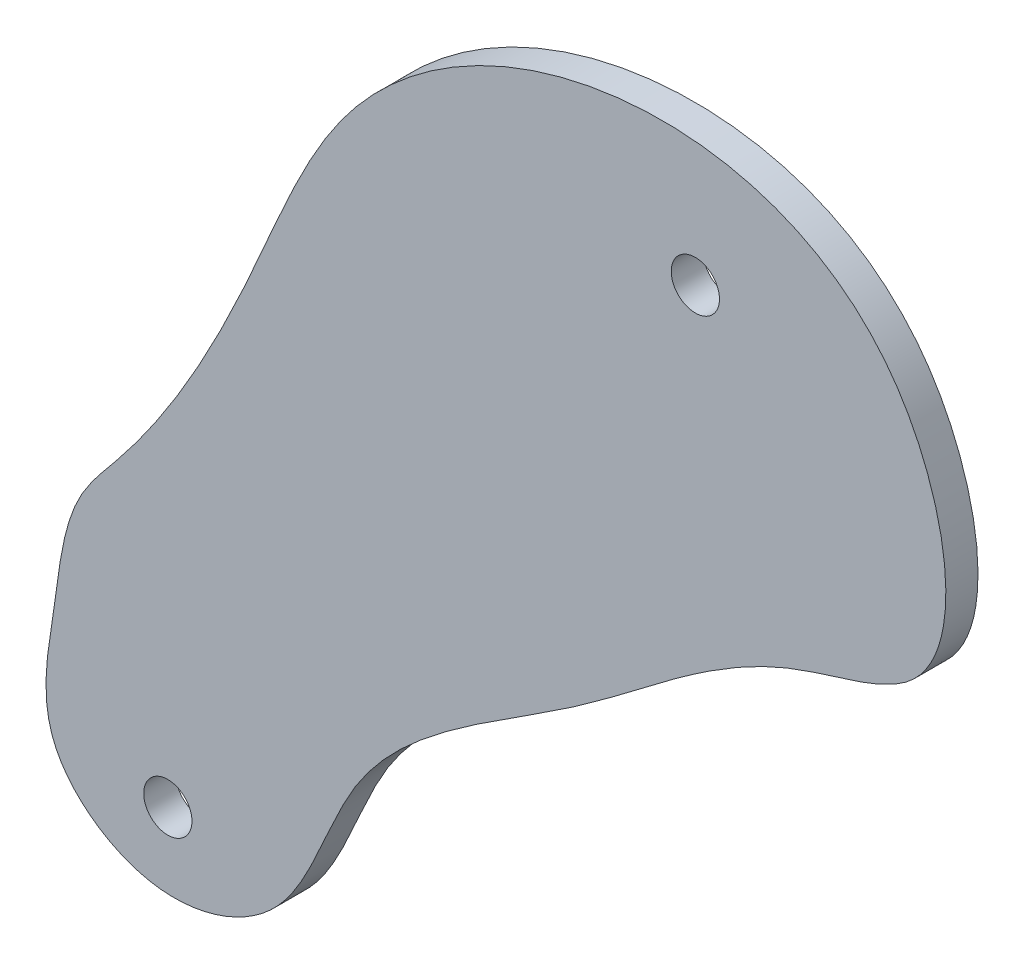
ISO-10303-21;
HEADER;
FILE_DESCRIPTION(('STEP AP214'),'2;1');
FILE_NAME('part.step','',(''),(''),'','','');
FILE_SCHEMA(('AUTOMOTIVE_DESIGN { 1 0 10303 214 1 1 1 1 }'));
ENDSEC;
DATA;
#1=APPLICATION_CONTEXT('core data for automotive mechanical design processes');
#2=APPLICATION_PROTOCOL_DEFINITION('international standard','automotive_design',2000,#1);
#3=PRODUCT_CONTEXT('',#1,'mechanical');
#4=PRODUCT('Part','Part','',(#3));
#5=PRODUCT_RELATED_PRODUCT_CATEGORY('part','',(#4));
#6=PRODUCT_DEFINITION_FORMATION('','',#4);
#7=PRODUCT_DEFINITION_CONTEXT('part definition',#1,'design');
#8=PRODUCT_DEFINITION('design','',#6,#7);
#9=PRODUCT_DEFINITION_SHAPE('','',#8);
#10=(LENGTH_UNIT() NAMED_UNIT(*) SI_UNIT(.MILLI.,.METRE.));
#11=(NAMED_UNIT(*) PLANE_ANGLE_UNIT() SI_UNIT($,.RADIAN.));
#12=(NAMED_UNIT(*) SI_UNIT($,.STERADIAN.) SOLID_ANGLE_UNIT());
#13=UNCERTAINTY_MEASURE_WITH_UNIT(LENGTH_MEASURE(1.E-05),#10,'distance_accuracy_value','');
#14=(GEOMETRIC_REPRESENTATION_CONTEXT(3) GLOBAL_UNCERTAINTY_ASSIGNED_CONTEXT((#13)) GLOBAL_UNIT_ASSIGNED_CONTEXT((#10,
#11,#12)) REPRESENTATION_CONTEXT('',''));
#15=CARTESIAN_POINT('',(0.,0.,0.));
#16=DIRECTION('',(0.,0.,1.));
#17=DIRECTION('',(1.,0.,0.));
#18=AXIS2_PLACEMENT_3D('',#15,#16,#17);
#19=CARTESIAN_POINT('',(279.692520329998,142.4888097413,3.73351036661345));
#20=DIRECTION('',(0.,0.,1.));
#21=DIRECTION('',(1.,0.,0.));
#22=AXIS2_PLACEMENT_3D('',#19,#20,#21);
#23=PLANE('',#22);
#24=CARTESIAN_POINT('',(208.048555384954,96.1469036247698,3.73351036661345));
#25=DIRECTION('',(0.,0.,1.));
#26=DIRECTION('',(1.,0.,0.));
#27=AXIS2_PLACEMENT_3D('',#24,#25,#26);
#28=CIRCLE('',#27,2.38125);
#29=CARTESIAN_POINT('',(210.429805384954,96.1469036247698,3.73351036661345));
#30=VERTEX_POINT('',#29);
#31=EDGE_CURVE('E60',#30,#30,#28,.T.);
#32=ORIENTED_EDGE('',*,*,#31,.F.);
#33=EDGE_LOOP('',(#32));
#34=FACE_BOUND('',#33,.T.);
#35=CARTESIAN_POINT('',(260.138309761165,166.844556812902,3.73351036661345));
#36=DIRECTION('',(0.,0.,1.));
#37=DIRECTION('',(1.,0.,0.));
#38=AXIS2_PLACEMENT_3D('',#35,#36,#37);
#39=CIRCLE('',#38,2.38125);
#40=CARTESIAN_POINT('',(262.519559761165,166.844556812902,3.73351036661345));
#41=VERTEX_POINT('',#40);
#42=EDGE_CURVE('E51',#41,#41,#39,.T.);
#43=ORIENTED_EDGE('',*,*,#42,.F.);
#44=EDGE_LOOP('',(#43));
#45=FACE_BOUND('',#44,.T.);
#46=CARTESIAN_POINT('',(202.929361245628,123.211313888378,3.73351036661345));
#47=CARTESIAN_POINT('',(201.739714405265,121.749830512483,3.73351036661345));
#48=CARTESIAN_POINT('',(197.890302733748,117.390116329477,3.73351036661345));
#49=CARTESIAN_POINT('',(197.036864552965,107.690088163987,3.73351036661345));
#50=CARTESIAN_POINT('',(194.501914276714,95.2537043682636,3.73351036661345));
#51=CARTESIAN_POINT('',(206.384507392569,86.6634191277051,3.73351036661345));
#52=CARTESIAN_POINT('',(218.786123850465,90.8911417489097,3.73351036661345));
#53=CARTESIAN_POINT('',(223.064430740751,99.9923607362149,3.73351036661345));
#54=CARTESIAN_POINT('',(229.145568082793,113.97669399169,3.73351036661345));
#55=CARTESIAN_POINT('',(249.189438648727,123.748329584924,3.73351036661345));
#56=CARTESIAN_POINT('',(264.843217760194,138.802913713592,3.73351036661345));
#57=CARTESIAN_POINT('',(288.149427972228,143.05898755066,3.73351036661345));
#58=CARTESIAN_POINT('',(282.305203308027,177.381342809915,3.73351036661345));
#59=CARTESIAN_POINT('',(248.582859196143,182.538043843834,3.73351036661345));
#60=CARTESIAN_POINT('',(224.914413667774,167.097053658812,3.73351036661345));
#61=CARTESIAN_POINT('',(215.899807197198,144.043459163717,3.73351036661345));
#62=CARTESIAN_POINT('',(208.713846979568,130.317565467772,3.73351036661345));
#63=CARTESIAN_POINT('',(202.929361245628,123.211313888378,3.73351036661345));
#64=B_SPLINE_CURVE_WITH_KNOTS('',3,(#46,#47,#48,#49,#50,#51,#52,#53,#54,#55,#56,#57,#58,#59,#60,
#61,#62,#63),.UNSPECIFIED.,.T.,.F.,(4,1,1,1,1,1,1,1,1,1,1,1,1,1,1,4),(0.,0.0208595902878433,
0.0638627373197864,0.106624897409865,0.152099282665817,0.197954811394257,0.233553888651535,
0.261539965771382,0.367580775776517,0.464212701141376,0.509543331395073,0.602655177856791,
0.727730123117939,0.825803478402235,0.898573258599143,1.),.UNSPECIFIED.);
#65=CARTESIAN_POINT('',(202.929361245628,123.211313888378,3.73351036661345));
#66=VERTEX_POINT('',#65);
#67=EDGE_CURVE('E10',#66,#66,#64,.T.);
#68=ORIENTED_EDGE('',*,*,#67,.T.);
#69=EDGE_LOOP('',(#68));
#70=FACE_BOUND('',#69,.T.);
#71=ADVANCED_FACE('F33',(#34,#45,#70),#23,.T.);
#72=CARTESIAN_POINT('',(279.692520329998,142.4888097413,0.55851036697136));
#73=DIRECTION('',(0.,0.,1.));
#74=DIRECTION('',(1.,0.,0.));
#75=AXIS2_PLACEMENT_3D('',#72,#73,#74);
#76=PLANE('',#75);
#77=CARTESIAN_POINT('',(208.048555384954,96.1469036247698,0.55851036697136));
#78=DIRECTION('',(0.,0.,1.));
#79=DIRECTION('',(1.,0.,0.));
#80=AXIS2_PLACEMENT_3D('',#77,#78,#79);
#81=CIRCLE('',#80,2.38125);
#82=CARTESIAN_POINT('',(210.429805384954,96.1469036247698,0.55851036697136));
#83=VERTEX_POINT('',#82);
#84=EDGE_CURVE('E57',#83,#83,#81,.T.);
#85=ORIENTED_EDGE('',*,*,#84,.T.);
#86=EDGE_LOOP('',(#85));
#87=FACE_BOUND('',#86,.T.);
#88=CARTESIAN_POINT('',(260.138309761165,166.844556812902,0.55851036697136));
#89=DIRECTION('',(0.,0.,1.));
#90=DIRECTION('',(1.,0.,0.));
#91=AXIS2_PLACEMENT_3D('',#88,#89,#90);
#92=CIRCLE('',#91,2.38125);
#93=CARTESIAN_POINT('',(262.519559761165,166.844556812902,0.55851036697136));
#94=VERTEX_POINT('',#93);
#95=EDGE_CURVE('E46',#94,#94,#92,.T.);
#96=ORIENTED_EDGE('',*,*,#95,.T.);
#97=EDGE_LOOP('',(#96));
#98=FACE_BOUND('',#97,.T.);
#99=CARTESIAN_POINT('',(202.929361245628,123.211313888378,0.55851036697136));
#100=CARTESIAN_POINT('',(201.739714405265,121.749830512483,0.55851036697136));
#101=CARTESIAN_POINT('',(197.890302733748,117.390116329477,0.55851036697136));
#102=CARTESIAN_POINT('',(197.036864552965,107.690088163987,0.55851036697136));
#103=CARTESIAN_POINT('',(194.501914276714,95.2537043682636,0.55851036697136));
#104=CARTESIAN_POINT('',(206.384507392569,86.6634191277051,0.55851036697136));
#105=CARTESIAN_POINT('',(218.786123850465,90.8911417489097,0.55851036697136));
#106=CARTESIAN_POINT('',(223.064430740751,99.9923607362149,0.55851036697136));
#107=CARTESIAN_POINT('',(229.145568082793,113.97669399169,0.55851036697136));
#108=CARTESIAN_POINT('',(249.189438648727,123.748329584924,0.55851036697136));
#109=CARTESIAN_POINT('',(264.843217760194,138.802913713592,0.55851036697136));
#110=CARTESIAN_POINT('',(288.149427972228,143.05898755066,0.55851036697136));
#111=CARTESIAN_POINT('',(282.305203308027,177.381342809915,0.55851036697136));
#112=CARTESIAN_POINT('',(248.582859196143,182.538043843834,0.55851036697136));
#113=CARTESIAN_POINT('',(224.914413667774,167.097053658812,0.55851036697136));
#114=CARTESIAN_POINT('',(215.899807197198,144.043459163717,0.55851036697136));
#115=CARTESIAN_POINT('',(208.713846979568,130.317565467772,0.55851036697136));
#116=CARTESIAN_POINT('',(202.929361245628,123.211313888378,0.55851036697136));
#117=B_SPLINE_CURVE_WITH_KNOTS('',3,(#99,#100,#101,#102,#103,#104,#105,#106,#107,#108,#109,#110,
#111,#112,#113,#114,#115,#116),.UNSPECIFIED.,.T.,.F.,(4,1,1,1,1,1,1,1,1,1,1,1,1,1,1,4),(0.,
0.0208595902878433,0.0638627373197864,0.106624897409865,0.152099282665817,0.197954811394257,
0.233553888651535,0.261539965771382,0.367580775776517,0.464212701141376,0.509543331395073,
0.602655177856791,0.727730123117939,0.825803478402235,0.898573258599143,1.),.UNSPECIFIED.);
#118=CARTESIAN_POINT('',(202.929361245628,123.211313888378,0.55851036697136));
#119=VERTEX_POINT('',#118);
#120=EDGE_CURVE('E38',#119,#119,#117,.T.);
#121=ORIENTED_EDGE('',*,*,#120,.F.);
#122=EDGE_LOOP('',(#121));
#123=FACE_BOUND('',#122,.T.);
#124=ADVANCED_FACE('F66',(#87,#98,#123),#76,.F.);
#125=DIRECTION('',(0.,0.,-1.));
#126=VECTOR('',#125,1.);
#127=SURFACE_OF_LINEAR_EXTRUSION('',#64,#126);
#128=ORIENTED_EDGE('',*,*,#67,.F.);
#129=EDGE_LOOP('',(#128));
#130=FACE_BOUND('',#129,.T.);
#131=ORIENTED_EDGE('',*,*,#120,.T.);
#132=EDGE_LOOP('',(#131));
#133=FACE_BOUND('',#132,.T.);
#134=ADVANCED_FACE('F35',(#130,#133),#127,.F.);
#135=CARTESIAN_POINT('',(260.138309761165,166.844556812902,0.55851036697136));
#136=DIRECTION('',(0.,0.,1.));
#137=DIRECTION('',(1.,0.,0.));
#138=AXIS2_PLACEMENT_3D('',#135,#136,#137);
#139=CYLINDRICAL_SURFACE('',#138,2.38125);
#140=ORIENTED_EDGE('',*,*,#95,.F.);
#141=EDGE_LOOP('',(#140));
#142=FACE_BOUND('',#141,.T.);
#143=ORIENTED_EDGE('',*,*,#42,.T.);
#144=EDGE_LOOP('',(#143));
#145=FACE_BOUND('',#144,.T.);
#146=ADVANCED_FACE('F72',(#142,#145),#139,.F.);
#147=CARTESIAN_POINT('',(208.048555384954,96.1469036247698,0.55851036697136));
#148=DIRECTION('',(0.,0.,1.));
#149=DIRECTION('',(1.,0.,0.));
#150=AXIS2_PLACEMENT_3D('',#147,#148,#149);
#151=CYLINDRICAL_SURFACE('',#150,2.38125);
#152=ORIENTED_EDGE('',*,*,#84,.F.);
#153=EDGE_LOOP('',(#152));
#154=FACE_BOUND('',#153,.T.);
#155=ORIENTED_EDGE('',*,*,#31,.T.);
#156=EDGE_LOOP('',(#155));
#157=FACE_BOUND('',#156,.T.);
#158=ADVANCED_FACE('F69',(#154,#157),#151,.F.);
#159=CLOSED_SHELL('',(#71,#124,#134,#146,#158));
#160=MANIFOLD_SOLID_BREP('B2',#159);
#161=ADVANCED_BREP_SHAPE_REPRESENTATION('',(#18,#160),#14);
#162=SHAPE_DEFINITION_REPRESENTATION(#9,#161);
ENDSEC;
END-ISO-10303-21;
